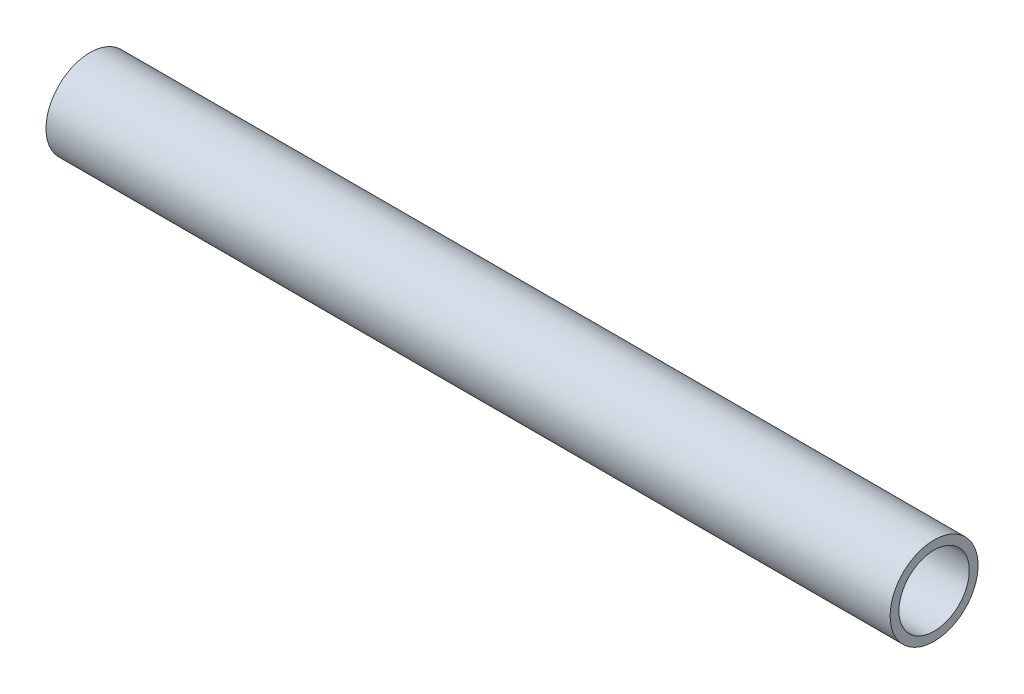
ISO-10303-21;
HEADER;
FILE_DESCRIPTION(('STEP AP214'),'2;1');
FILE_NAME('part.step','',(''),(''),'','','');
FILE_SCHEMA(('AUTOMOTIVE_DESIGN { 1 0 10303 214 1 1 1 1 }'));
ENDSEC;
DATA;
#1=APPLICATION_CONTEXT('core data for automotive mechanical design processes');
#2=APPLICATION_PROTOCOL_DEFINITION('international standard','automotive_design',2000,#1);
#3=PRODUCT_CONTEXT('',#1,'mechanical');
#4=PRODUCT('Part','Part','',(#3));
#5=PRODUCT_RELATED_PRODUCT_CATEGORY('part','',(#4));
#6=PRODUCT_DEFINITION_FORMATION('','',#4);
#7=PRODUCT_DEFINITION_CONTEXT('part definition',#1,'design');
#8=PRODUCT_DEFINITION('design','',#6,#7);
#9=PRODUCT_DEFINITION_SHAPE('','',#8);
#10=(LENGTH_UNIT() NAMED_UNIT(*) SI_UNIT(.MILLI.,.METRE.));
#11=(NAMED_UNIT(*) PLANE_ANGLE_UNIT() SI_UNIT($,.RADIAN.));
#12=(NAMED_UNIT(*) SI_UNIT($,.STERADIAN.) SOLID_ANGLE_UNIT());
#13=UNCERTAINTY_MEASURE_WITH_UNIT(LENGTH_MEASURE(1.E-05),#10,'distance_accuracy_value','');
#14=(GEOMETRIC_REPRESENTATION_CONTEXT(3) GLOBAL_UNCERTAINTY_ASSIGNED_CONTEXT((#13)) GLOBAL_UNIT_ASSIGNED_CONTEXT((#10,
#11,#12)) REPRESENTATION_CONTEXT('',''));
#15=CARTESIAN_POINT('',(0.,0.,0.));
#16=DIRECTION('',(0.,0.,1.));
#17=DIRECTION('',(1.,0.,0.));
#18=AXIS2_PLACEMENT_3D('',#15,#16,#17);
#19=CARTESIAN_POINT('',(152.4,0.,0.));
#20=DIRECTION('',(1.,0.,0.));
#21=DIRECTION('',(0.,0.,-1.));
#22=AXIS2_PLACEMENT_3D('',#19,#20,#21);
#23=PLANE('',#22);
#24=CARTESIAN_POINT('',(152.4,0.,0.));
#25=DIRECTION('',(1.,0.,0.));
#26=DIRECTION('',(0.,0.,-1.));
#27=AXIS2_PLACEMENT_3D('',#24,#25,#26);
#28=CIRCLE('',#27,15.875);
#29=CARTESIAN_POINT('',(152.4,0.,15.875));
#30=VERTEX_POINT('',#29);
#31=EDGE_CURVE('E10',#30,#30,#28,.T.);
#32=ORIENTED_EDGE('',*,*,#31,.T.);
#33=EDGE_LOOP('',(#32));
#34=FACE_BOUND('',#33,.T.);
#35=CARTESIAN_POINT('',(152.4,0.,0.));
#36=DIRECTION('',(1.,0.,0.));
#37=DIRECTION('',(0.,0.,-1.));
#38=AXIS2_PLACEMENT_3D('',#35,#36,#37);
#39=CIRCLE('',#38,12.7);
#40=CARTESIAN_POINT('',(152.4,0.,12.7));
#41=VERTEX_POINT('',#40);
#42=EDGE_CURVE('E43',#41,#41,#39,.T.);
#43=ORIENTED_EDGE('',*,*,#42,.F.);
#44=EDGE_LOOP('',(#43));
#45=FACE_BOUND('',#44,.T.);
#46=ADVANCED_FACE('F32',(#34,#45),#23,.T.);
#47=CARTESIAN_POINT('',(-152.4,0.,0.));
#48=DIRECTION('',(1.,0.,0.));
#49=DIRECTION('',(0.,0.,-1.));
#50=AXIS2_PLACEMENT_3D('',#47,#48,#49);
#51=PLANE('',#50);
#52=CARTESIAN_POINT('',(-152.4,0.,0.));
#53=DIRECTION('',(1.,0.,0.));
#54=DIRECTION('',(0.,0.,-1.));
#55=AXIS2_PLACEMENT_3D('',#52,#53,#54);
#56=CIRCLE('',#55,15.875);
#57=CARTESIAN_POINT('',(-152.4,0.,15.875));
#58=VERTEX_POINT('',#57);
#59=EDGE_CURVE('E36',#58,#58,#56,.T.);
#60=ORIENTED_EDGE('',*,*,#59,.F.);
#61=EDGE_LOOP('',(#60));
#62=FACE_BOUND('',#61,.T.);
#63=CARTESIAN_POINT('',(-152.4,0.,0.));
#64=DIRECTION('',(1.,0.,0.));
#65=DIRECTION('',(0.,0.,-1.));
#66=AXIS2_PLACEMENT_3D('',#63,#64,#65);
#67=CIRCLE('',#66,12.7);
#68=CARTESIAN_POINT('',(-152.4,0.,12.7));
#69=VERTEX_POINT('',#68);
#70=EDGE_CURVE('E45',#69,#69,#67,.T.);
#71=ORIENTED_EDGE('',*,*,#70,.T.);
#72=EDGE_LOOP('',(#71));
#73=FACE_BOUND('',#72,.T.);
#74=ADVANCED_FACE('F55',(#62,#73),#51,.F.);
#75=CARTESIAN_POINT('',(152.4,0.,0.));
#76=DIRECTION('',(-1.,0.,0.));
#77=DIRECTION('',(0.,0.,1.));
#78=AXIS2_PLACEMENT_3D('',#75,#76,#77);
#79=CYLINDRICAL_SURFACE('',#78,15.875);
#80=CARTESIAN_POINT('',(152.4,0.,15.875));
#81=CARTESIAN_POINT('',(149.225,0.,15.875));
#82=CARTESIAN_POINT('',(146.05,0.,15.875));
#83=CARTESIAN_POINT('',(139.7,0.,15.875));
#84=CARTESIAN_POINT('',(136.525,0.,15.875));
#85=CARTESIAN_POINT('',(130.175,0.,15.875));
#86=CARTESIAN_POINT('',(127.,0.,15.875));
#87=CARTESIAN_POINT('',(120.65,0.,15.875));
#88=CARTESIAN_POINT('',(117.475,0.,15.875));
#89=CARTESIAN_POINT('',(111.125,0.,15.875));
#90=CARTESIAN_POINT('',(107.95,0.,15.875));
#91=CARTESIAN_POINT('',(101.6,0.,15.875));
#92=CARTESIAN_POINT('',(98.425,0.,15.875));
#93=CARTESIAN_POINT('',(92.075,0.,15.875));
#94=CARTESIAN_POINT('',(88.9,0.,15.875));
#95=CARTESIAN_POINT('',(82.55,0.,15.875));
#96=CARTESIAN_POINT('',(79.375,0.,15.875));
#97=CARTESIAN_POINT('',(73.025,0.,15.875));
#98=CARTESIAN_POINT('',(69.85,0.,15.875));
#99=CARTESIAN_POINT('',(63.5,0.,15.875));
#100=CARTESIAN_POINT('',(60.325,0.,15.875));
#101=CARTESIAN_POINT('',(53.975,0.,15.875));
#102=CARTESIAN_POINT('',(50.8,0.,15.875));
#103=CARTESIAN_POINT('',(44.45,0.,15.875));
#104=CARTESIAN_POINT('',(41.275,0.,15.875));
#105=CARTESIAN_POINT('',(34.925,0.,15.875));
#106=CARTESIAN_POINT('',(31.75,0.,15.875));
#107=CARTESIAN_POINT('',(25.4,0.,15.875));
#108=CARTESIAN_POINT('',(22.225,0.,15.875));
#109=CARTESIAN_POINT('',(15.875,0.,15.875));
#110=CARTESIAN_POINT('',(12.7,0.,15.875));
#111=CARTESIAN_POINT('',(6.35,0.,15.875));
#112=CARTESIAN_POINT('',(3.175,0.,15.875));
#113=CARTESIAN_POINT('',(-3.175,0.,15.875));
#114=CARTESIAN_POINT('',(-6.35,0.,15.875));
#115=CARTESIAN_POINT('',(-12.7,0.,15.875));
#116=CARTESIAN_POINT('',(-15.875,0.,15.875));
#117=CARTESIAN_POINT('',(-22.225,0.,15.875));
#118=CARTESIAN_POINT('',(-25.4,0.,15.875));
#119=CARTESIAN_POINT('',(-31.75,0.,15.875));
#120=CARTESIAN_POINT('',(-34.925,0.,15.875));
#121=CARTESIAN_POINT('',(-41.275,0.,15.875));
#122=CARTESIAN_POINT('',(-44.45,0.,15.875));
#123=CARTESIAN_POINT('',(-50.8,0.,15.875));
#124=CARTESIAN_POINT('',(-53.975,0.,15.875));
#125=CARTESIAN_POINT('',(-60.325,0.,15.875));
#126=CARTESIAN_POINT('',(-63.5,0.,15.875));
#127=CARTESIAN_POINT('',(-69.85,0.,15.875));
#128=CARTESIAN_POINT('',(-73.025,0.,15.875));
#129=CARTESIAN_POINT('',(-79.375,0.,15.875));
#130=CARTESIAN_POINT('',(-82.55,0.,15.875));
#131=CARTESIAN_POINT('',(-88.9,0.,15.875));
#132=CARTESIAN_POINT('',(-92.075,0.,15.875));
#133=CARTESIAN_POINT('',(-98.425,0.,15.875));
#134=CARTESIAN_POINT('',(-101.6,0.,15.875));
#135=CARTESIAN_POINT('',(-107.95,0.,15.875));
#136=CARTESIAN_POINT('',(-111.125,0.,15.875));
#137=CARTESIAN_POINT('',(-117.475,0.,15.875));
#138=CARTESIAN_POINT('',(-120.65,0.,15.875));
#139=CARTESIAN_POINT('',(-127.,0.,15.875));
#140=CARTESIAN_POINT('',(-130.175,0.,15.875));
#141=CARTESIAN_POINT('',(-136.525,0.,15.875));
#142=CARTESIAN_POINT('',(-139.7,0.,15.875));
#143=CARTESIAN_POINT('',(-146.05,0.,15.875));
#144=CARTESIAN_POINT('',(-149.225,0.,15.875));
#145=CARTESIAN_POINT('',(-152.4,0.,15.875));
#146=B_SPLINE_CURVE_WITH_KNOTS('',3,(#80,#81,#82,#83,#84,#85,#86,#87,#88,#89,#90,#91,#92,#93,
#94,#95,#96,#97,#98,#99,#100,#101,#102,#103,#104,#105,#106,#107,#108,#109,#110,#111,#112,#113,
#114,#115,#116,#117,#118,#119,#120,#121,#122,#123,#124,#125,#126,#127,#128,#129,#130,#131,#132,
#133,#134,#135,#136,#137,#138,#139,#140,#141,#142,#143,#144,#145),.UNSPECIFIED.,.F.,.F.,(4,2,2,
2,2,2,2,2,2,2,2,2,2,2,2,2,2,2,2,2,2,2,2,2,2,2,2,2,2,2,2,2,4),(0.,9.52500000000001,19.05,28.575,
38.1,47.625,57.15,66.675,76.2,85.725,95.25,104.775,114.3,123.825,133.35,142.875,152.4,161.925,
171.45,180.975,190.5,200.025,209.55,219.075,228.6,238.125,247.65,257.175,266.7,276.225,285.75,
295.275,304.8),.UNSPECIFIED.);
#147=EDGE_CURVE('BSEAM34',#30,#58,#146,.T.);
#148=ORIENTED_EDGE('',*,*,#31,.F.);
#149=ORIENTED_EDGE('',*,*,#59,.T.);
#150=ORIENTED_EDGE('',*,*,#147,.T.);
#151=ORIENTED_EDGE('',*,*,#147,.F.);
#152=EDGE_LOOP('',(#148,#150,#149,#151));
#153=FACE_BOUND('',#152,.T.);
#154=ADVANCED_FACE('F34',(#153),#79,.T.);
#155=CARTESIAN_POINT('',(152.4,0.,0.));
#156=DIRECTION('',(-1.,0.,0.));
#157=DIRECTION('',(0.,0.,1.));
#158=AXIS2_PLACEMENT_3D('',#155,#156,#157);
#159=CYLINDRICAL_SURFACE('',#158,12.7);
#160=CARTESIAN_POINT('',(152.4,0.,12.7));
#161=CARTESIAN_POINT('',(149.225,0.,12.7));
#162=CARTESIAN_POINT('',(146.05,0.,12.7));
#163=CARTESIAN_POINT('',(139.7,0.,12.7));
#164=CARTESIAN_POINT('',(136.525,0.,12.7));
#165=CARTESIAN_POINT('',(130.175,0.,12.7));
#166=CARTESIAN_POINT('',(127.,0.,12.7));
#167=CARTESIAN_POINT('',(120.65,0.,12.7));
#168=CARTESIAN_POINT('',(117.475,0.,12.7));
#169=CARTESIAN_POINT('',(111.125,0.,12.7));
#170=CARTESIAN_POINT('',(107.95,0.,12.7));
#171=CARTESIAN_POINT('',(101.6,0.,12.7));
#172=CARTESIAN_POINT('',(98.425,0.,12.7));
#173=CARTESIAN_POINT('',(92.075,0.,12.7));
#174=CARTESIAN_POINT('',(88.9,0.,12.7));
#175=CARTESIAN_POINT('',(82.55,0.,12.7));
#176=CARTESIAN_POINT('',(79.375,0.,12.7));
#177=CARTESIAN_POINT('',(73.025,0.,12.7));
#178=CARTESIAN_POINT('',(69.85,0.,12.7));
#179=CARTESIAN_POINT('',(63.5,0.,12.7));
#180=CARTESIAN_POINT('',(60.325,0.,12.7));
#181=CARTESIAN_POINT('',(53.975,0.,12.7));
#182=CARTESIAN_POINT('',(50.8,0.,12.7));
#183=CARTESIAN_POINT('',(44.45,0.,12.7));
#184=CARTESIAN_POINT('',(41.275,0.,12.7));
#185=CARTESIAN_POINT('',(34.925,0.,12.7));
#186=CARTESIAN_POINT('',(31.75,0.,12.7));
#187=CARTESIAN_POINT('',(25.4,0.,12.7));
#188=CARTESIAN_POINT('',(22.225,0.,12.7));
#189=CARTESIAN_POINT('',(15.875,0.,12.7));
#190=CARTESIAN_POINT('',(12.7,0.,12.7));
#191=CARTESIAN_POINT('',(6.35,0.,12.7));
#192=CARTESIAN_POINT('',(3.175,0.,12.7));
#193=CARTESIAN_POINT('',(-3.175,0.,12.7));
#194=CARTESIAN_POINT('',(-6.35,0.,12.7));
#195=CARTESIAN_POINT('',(-12.7,0.,12.7));
#196=CARTESIAN_POINT('',(-15.875,0.,12.7));
#197=CARTESIAN_POINT('',(-22.225,0.,12.7));
#198=CARTESIAN_POINT('',(-25.4,0.,12.7));
#199=CARTESIAN_POINT('',(-31.75,0.,12.7));
#200=CARTESIAN_POINT('',(-34.925,0.,12.7));
#201=CARTESIAN_POINT('',(-41.275,0.,12.7));
#202=CARTESIAN_POINT('',(-44.45,0.,12.7));
#203=CARTESIAN_POINT('',(-50.8,0.,12.7));
#204=CARTESIAN_POINT('',(-53.975,0.,12.7));
#205=CARTESIAN_POINT('',(-60.325,0.,12.7));
#206=CARTESIAN_POINT('',(-63.5,0.,12.7));
#207=CARTESIAN_POINT('',(-69.85,0.,12.7));
#208=CARTESIAN_POINT('',(-73.025,0.,12.7));
#209=CARTESIAN_POINT('',(-79.375,0.,12.7));
#210=CARTESIAN_POINT('',(-82.55,0.,12.7));
#211=CARTESIAN_POINT('',(-88.9,0.,12.7));
#212=CARTESIAN_POINT('',(-92.075,0.,12.7));
#213=CARTESIAN_POINT('',(-98.425,0.,12.7));
#214=CARTESIAN_POINT('',(-101.6,0.,12.7));
#215=CARTESIAN_POINT('',(-107.95,0.,12.7));
#216=CARTESIAN_POINT('',(-111.125,0.,12.7));
#217=CARTESIAN_POINT('',(-117.475,0.,12.7));
#218=CARTESIAN_POINT('',(-120.65,0.,12.7));
#219=CARTESIAN_POINT('',(-127.,0.,12.7));
#220=CARTESIAN_POINT('',(-130.175,0.,12.7));
#221=CARTESIAN_POINT('',(-136.525,0.,12.7));
#222=CARTESIAN_POINT('',(-139.7,0.,12.7));
#223=CARTESIAN_POINT('',(-146.05,0.,12.7));
#224=CARTESIAN_POINT('',(-149.225,0.,12.7));
#225=CARTESIAN_POINT('',(-152.4,0.,12.7));
#226=B_SPLINE_CURVE_WITH_KNOTS('',3,(#160,#161,#162,#163,#164,#165,#166,#167,#168,#169,#170,
#171,#172,#173,#174,#175,#176,#177,#178,#179,#180,#181,#182,#183,#184,#185,#186,#187,#188,#189,
#190,#191,#192,#193,#194,#195,#196,#197,#198,#199,#200,#201,#202,#203,#204,#205,#206,#207,#208,
#209,#210,#211,#212,#213,#214,#215,#216,#217,#218,#219,#220,#221,#222,#223,#224,#225),
.UNSPECIFIED.,.F.,.F.,(4,2,2,2,2,2,2,2,2,2,2,2,2,2,2,2,2,2,2,2,2,2,2,2,2,2,2,2,2,2,2,2,4),(0.,
9.52500000000001,19.05,28.575,38.1,47.625,57.15,66.675,76.2,85.725,95.25,104.775,114.3,123.825,
133.35,142.875,152.4,161.925,171.45,180.975,190.5,200.025,209.55,219.075,228.6,238.125,247.65,
257.175,266.7,276.225,285.75,295.275,304.8),.UNSPECIFIED.);
#227=EDGE_CURVE('BSEAM51',#41,#69,#226,.T.);
#228=ORIENTED_EDGE('',*,*,#42,.T.);
#229=ORIENTED_EDGE('',*,*,#70,.F.);
#230=ORIENTED_EDGE('',*,*,#227,.T.);
#231=ORIENTED_EDGE('',*,*,#227,.F.);
#232=EDGE_LOOP('',(#228,#230,#229,#231));
#233=FACE_BOUND('',#232,.T.);
#234=ADVANCED_FACE('F51',(#233),#159,.F.);
#235=CLOSED_SHELL('',(#46,#74,#154,#234));
#236=MANIFOLD_SOLID_BREP('B2',#235);
#237=ADVANCED_BREP_SHAPE_REPRESENTATION('',(#18,#236),#14);
#238=SHAPE_DEFINITION_REPRESENTATION(#9,#237);
ENDSEC;
END-ISO-10303-21;
